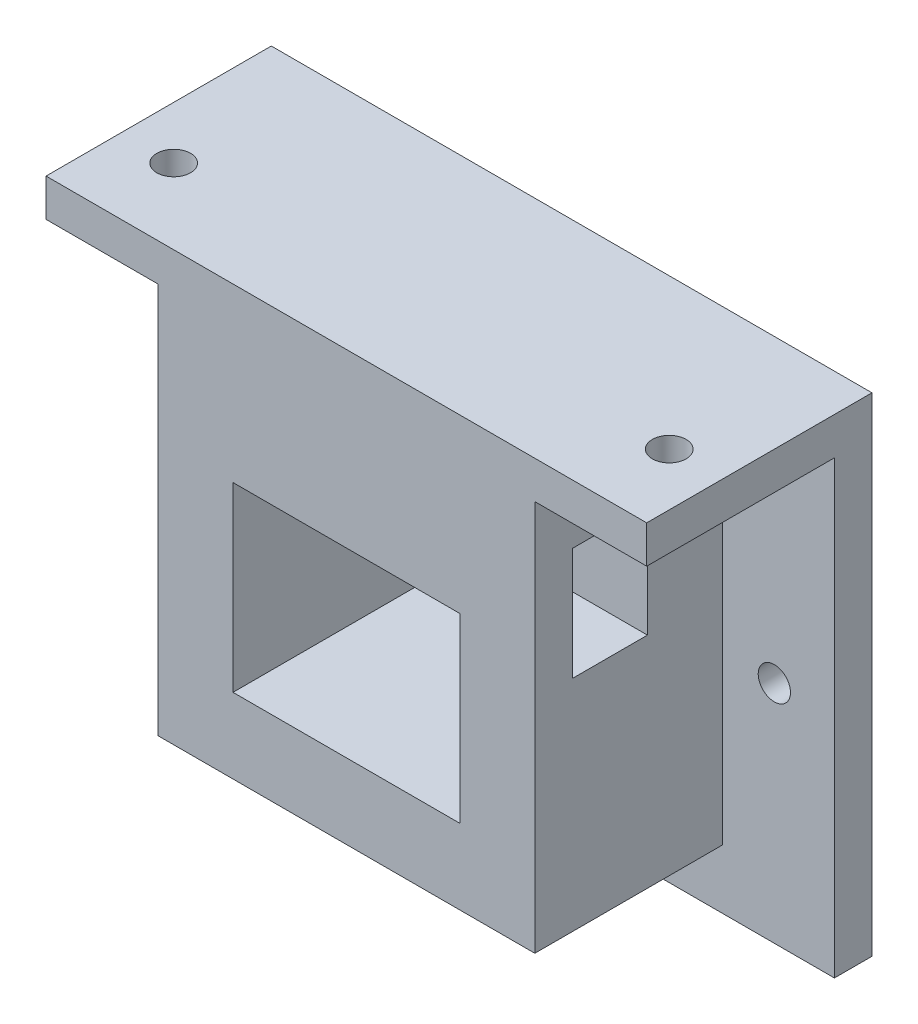
ISO-10303-21;
HEADER;
FILE_DESCRIPTION(('STEP AP214'),'2;1');
FILE_NAME('part.step','',(''),(''),'','','');
FILE_SCHEMA(('AUTOMOTIVE_DESIGN { 1 0 10303 214 1 1 1 1 }'));
ENDSEC;
DATA;
#1=APPLICATION_CONTEXT('core data for automotive mechanical design processes');
#2=APPLICATION_PROTOCOL_DEFINITION('international standard','automotive_design',2000,#1);
#3=PRODUCT_CONTEXT('',#1,'mechanical');
#4=PRODUCT('Part','Part','',(#3));
#5=PRODUCT_RELATED_PRODUCT_CATEGORY('part','',(#4));
#6=PRODUCT_DEFINITION_FORMATION('','',#4);
#7=PRODUCT_DEFINITION_CONTEXT('part definition',#1,'design');
#8=PRODUCT_DEFINITION('design','',#6,#7);
#9=PRODUCT_DEFINITION_SHAPE('','',#8);
#10=(LENGTH_UNIT() NAMED_UNIT(*) SI_UNIT(.MILLI.,.METRE.));
#11=(NAMED_UNIT(*) PLANE_ANGLE_UNIT() SI_UNIT($,.RADIAN.));
#12=(NAMED_UNIT(*) SI_UNIT($,.STERADIAN.) SOLID_ANGLE_UNIT());
#13=UNCERTAINTY_MEASURE_WITH_UNIT(LENGTH_MEASURE(1.E-05),#10,'distance_accuracy_value','');
#14=(GEOMETRIC_REPRESENTATION_CONTEXT(3) GLOBAL_UNCERTAINTY_ASSIGNED_CONTEXT((#13)) GLOBAL_UNIT_ASSIGNED_CONTEXT((#10,
#11,#12)) REPRESENTATION_CONTEXT('',''));
#15=CARTESIAN_POINT('',(0.,0.,0.));
#16=DIRECTION('',(0.,0.,1.));
#17=DIRECTION('',(1.,0.,0.));
#18=AXIS2_PLACEMENT_3D('',#15,#16,#17);
#19=CARTESIAN_POINT('',(0.,0.,5.));
#20=DIRECTION('',(0.,0.,-1.));
#21=DIRECTION('',(-1.,0.,0.));
#22=AXIS2_PLACEMENT_3D('',#19,#20,#21);
#23=PLANE('',#22);
#24=CARTESIAN_POINT('',(8.,30.,5.));
#25=DIRECTION('',(0.,0.,-1.));
#26=DIRECTION('',(-1.,0.,0.));
#27=AXIS2_PLACEMENT_3D('',#24,#25,#26);
#28=CIRCLE('',#27,2.15);
#29=CARTESIAN_POINT('',(5.85,30.,5.));
#30=VERTEX_POINT('',#29);
#31=EDGE_CURVE('E589',#30,#30,#28,.T.);
#32=ORIENTED_EDGE('',*,*,#31,.T.);
#33=EDGE_LOOP('',(#32));
#34=FACE_BOUND('',#33,.T.);
#35=CARTESIAN_POINT('',(72.,30.,5.));
#36=DIRECTION('',(0.,0.,-1.));
#37=DIRECTION('',(-1.,0.,0.));
#38=AXIS2_PLACEMENT_3D('',#35,#36,#37);
#39=CIRCLE('',#38,2.14999999999999);
#40=CARTESIAN_POINT('',(69.85,30.,5.));
#41=VERTEX_POINT('',#40);
#42=EDGE_CURVE('E593',#41,#41,#39,.T.);
#43=ORIENTED_EDGE('',*,*,#42,.T.);
#44=EDGE_LOOP('',(#43));
#45=FACE_BOUND('',#44,.T.);
#46=DIRECTION('',(-1.,0.,0.));
#47=VECTOR('',#46,1.);
#48=CARTESIAN_POINT('',(0.,60.,5.));
#49=LINE('',#48,#47);
#50=CARTESIAN_POINT('',(80.,60.,5.));
#51=VERTEX_POINT('',#50);
#52=CARTESIAN_POINT('',(65.1,60.,5.));
#53=VERTEX_POINT('',#52);
#54=EDGE_CURVE('E415',#51,#53,#49,.T.);
#55=ORIENTED_EDGE('',*,*,#54,.T.);
#56=DIRECTION('',(0.,1.,0.));
#57=VECTOR('',#56,1.);
#58=CARTESIAN_POINT('',(65.1,7.9,5.));
#59=LINE('',#58,#57);
#60=CARTESIAN_POINT('',(65.1,7.9,5.));
#61=VERTEX_POINT('',#60);
#62=EDGE_CURVE('E378',#61,#53,#59,.T.);
#63=ORIENTED_EDGE('',*,*,#62,.F.);
#64=DIRECTION('',(1.,0.,0.));
#65=VECTOR('',#64,1.);
#66=CARTESIAN_POINT('',(14.9,7.9,5.));
#67=LINE('',#66,#65);
#68=CARTESIAN_POINT('',(14.9,7.9,5.));
#69=VERTEX_POINT('',#68);
#70=EDGE_CURVE('E389',#69,#61,#67,.T.);
#71=ORIENTED_EDGE('',*,*,#70,.F.);
#72=DIRECTION('',(0.,-1.,0.));
#73=VECTOR('',#72,1.);
#74=CARTESIAN_POINT('',(14.9,7.9,5.));
#75=LINE('',#74,#73);
#76=CARTESIAN_POINT('',(14.9,60.,5.));
#77=VERTEX_POINT('',#76);
#78=EDGE_CURVE('E372',#77,#69,#75,.T.);
#79=ORIENTED_EDGE('',*,*,#78,.F.);
#80=CARTESIAN_POINT('',(0.,60.,5.));
#81=VERTEX_POINT('',#80);
#82=EDGE_CURVE('E414',#77,#81,#49,.T.);
#83=ORIENTED_EDGE('',*,*,#82,.T.);
#84=DIRECTION('',(0.,-1.,0.));
#85=VECTOR('',#84,1.);
#86=CARTESIAN_POINT('',(0.,0.,5.));
#87=LINE('',#86,#85);
#88=CARTESIAN_POINT('',(0.,0.,5.));
#89=VERTEX_POINT('',#88);
#90=EDGE_CURVE('E402',#81,#89,#87,.T.);
#91=ORIENTED_EDGE('',*,*,#90,.T.);
#92=DIRECTION('',(1.,0.,0.));
#93=VECTOR('',#92,1.);
#94=CARTESIAN_POINT('',(0.,0.,5.));
#95=LINE('',#94,#93);
#96=CARTESIAN_POINT('',(80.,0.,5.));
#97=VERTEX_POINT('',#96);
#98=EDGE_CURVE('E406',#89,#97,#95,.T.);
#99=ORIENTED_EDGE('',*,*,#98,.T.);
#100=DIRECTION('',(0.,1.,0.));
#101=VECTOR('',#100,1.);
#102=CARTESIAN_POINT('',(80.,0.,5.));
#103=LINE('',#102,#101);
#104=EDGE_CURVE('E410',#97,#51,#103,.T.);
#105=ORIENTED_EDGE('',*,*,#104,.T.);
#106=EDGE_LOOP('',(#55,#63,#71,#79,#83,#91,#99,#105));
#107=FACE_BOUND('',#106,.T.);
#108=ADVANCED_FACE('F48',(#34,#45,#107),#23,.F.);
#109=CARTESIAN_POINT('',(14.9,7.9,30.));
#110=DIRECTION('',(1.,0.,0.));
#111=DIRECTION('',(0.,0.,-1.));
#112=AXIS2_PLACEMENT_3D('',#109,#110,#111);
#113=PLANE('',#112);
#114=DIRECTION('',(0.,0.,-1.));
#115=VECTOR('',#114,1.);
#116=CARTESIAN_POINT('',(14.9,60.,80.8178118379766));
#117=LINE('',#116,#115);
#118=CARTESIAN_POINT('',(14.9,60.,30.));
#119=VERTEX_POINT('',#118);
#120=EDGE_CURVE('E259',#119,#77,#117,.T.);
#121=ORIENTED_EDGE('',*,*,#120,.T.);
#122=ORIENTED_EDGE('',*,*,#78,.T.);
#123=DIRECTION('',(0.,0.,-1.));
#124=VECTOR('',#123,1.);
#125=CARTESIAN_POINT('',(14.9,7.9,30.));
#126=LINE('',#125,#124);
#127=CARTESIAN_POINT('',(14.9,7.9,30.));
#128=VERTEX_POINT('',#127);
#129=EDGE_CURVE('E216',#128,#69,#126,.T.);
#130=ORIENTED_EDGE('',*,*,#129,.F.);
#131=DIRECTION('',(0.,-1.,0.));
#132=VECTOR('',#131,1.);
#133=CARTESIAN_POINT('',(14.9,7.9,30.));
#134=LINE('',#133,#132);
#135=EDGE_CURVE('E373',#119,#128,#134,.T.);
#136=ORIENTED_EDGE('',*,*,#135,.F.);
#137=EDGE_LOOP('',(#121,#122,#130,#136));
#138=FACE_BOUND('',#137,.T.);
#139=DIRECTION('',(0.,-1.,0.));
#140=VECTOR('',#139,1.);
#141=CARTESIAN_POINT('',(14.9,7.9,15.));
#142=LINE('',#141,#140);
#143=CARTESIAN_POINT('',(14.9,52.1,15.));
#144=VERTEX_POINT('',#143);
#145=CARTESIAN_POINT('',(14.9,37.1,15.));
#146=VERTEX_POINT('',#145);
#147=EDGE_CURVE('E318',#144,#146,#142,.T.);
#148=ORIENTED_EDGE('',*,*,#147,.F.);
#149=DIRECTION('',(0.,0.,-1.));
#150=VECTOR('',#149,1.);
#151=CARTESIAN_POINT('',(14.9,52.1,80.8178118379766));
#152=LINE('',#151,#150);
#153=CARTESIAN_POINT('',(14.9,52.1,25.));
#154=VERTEX_POINT('',#153);
#155=EDGE_CURVE('E270',#154,#144,#152,.T.);
#156=ORIENTED_EDGE('',*,*,#155,.F.);
#157=DIRECTION('',(0.,1.,0.));
#158=VECTOR('',#157,1.);
#159=CARTESIAN_POINT('',(14.9,7.9,25.));
#160=LINE('',#159,#158);
#161=CARTESIAN_POINT('',(14.9,37.1,25.));
#162=VERTEX_POINT('',#161);
#163=EDGE_CURVE('E303',#162,#154,#160,.T.);
#164=ORIENTED_EDGE('',*,*,#163,.F.);
#165=DIRECTION('',(0.,0.,1.));
#166=VECTOR('',#165,1.);
#167=CARTESIAN_POINT('',(14.9,37.1,30.));
#168=LINE('',#167,#166);
#169=EDGE_CURVE('E328',#146,#162,#168,.T.);
#170=ORIENTED_EDGE('',*,*,#169,.F.);
#171=EDGE_LOOP('',(#148,#156,#164,#170));
#172=FACE_BOUND('',#171,.T.);
#173=ADVANCED_FACE('F504',(#138,#172),#113,.F.);
#174=CARTESIAN_POINT('',(65.1,7.9,30.));
#175=DIRECTION('',(-1.,0.,0.));
#176=DIRECTION('',(0.,0.,1.));
#177=AXIS2_PLACEMENT_3D('',#174,#175,#176);
#178=PLANE('',#177);
#179=ORIENTED_EDGE('',*,*,#62,.T.);
#180=DIRECTION('',(0.,0.,-1.));
#181=VECTOR('',#180,1.);
#182=CARTESIAN_POINT('',(65.1,60.,80.8178118379766));
#183=LINE('',#182,#181);
#184=CARTESIAN_POINT('',(65.1,60.,30.));
#185=VERTEX_POINT('',#184);
#186=EDGE_CURVE('E263',#185,#53,#183,.T.);
#187=ORIENTED_EDGE('',*,*,#186,.F.);
#188=DIRECTION('',(0.,1.,0.));
#189=VECTOR('',#188,1.);
#190=CARTESIAN_POINT('',(65.1,7.9,30.));
#191=LINE('',#190,#189);
#192=CARTESIAN_POINT('',(65.1,7.9,30.));
#193=VERTEX_POINT('',#192);
#194=EDGE_CURVE('E381',#193,#185,#191,.T.);
#195=ORIENTED_EDGE('',*,*,#194,.F.);
#196=DIRECTION('',(0.,0.,-1.));
#197=VECTOR('',#196,1.);
#198=CARTESIAN_POINT('',(65.1,7.9,30.));
#199=LINE('',#198,#197);
#200=EDGE_CURVE('E385',#193,#61,#199,.T.);
#201=ORIENTED_EDGE('',*,*,#200,.T.);
#202=EDGE_LOOP('',(#179,#187,#195,#201));
#203=FACE_BOUND('',#202,.T.);
#204=DIRECTION('',(0.,1.,0.));
#205=VECTOR('',#204,1.);
#206=CARTESIAN_POINT('',(65.1,7.9,15.));
#207=LINE('',#206,#205);
#208=CARTESIAN_POINT('',(65.1,37.1,15.));
#209=VERTEX_POINT('',#208);
#210=CARTESIAN_POINT('',(65.1,52.1,15.));
#211=VERTEX_POINT('',#210);
#212=EDGE_CURVE('E315',#209,#211,#207,.T.);
#213=ORIENTED_EDGE('',*,*,#212,.F.);
#214=DIRECTION('',(0.,0.,-1.));
#215=VECTOR('',#214,1.);
#216=CARTESIAN_POINT('',(65.1,37.1,30.));
#217=LINE('',#216,#215);
#218=CARTESIAN_POINT('',(65.1,37.1,25.));
#219=VERTEX_POINT('',#218);
#220=EDGE_CURVE('E325',#219,#209,#217,.T.);
#221=ORIENTED_EDGE('',*,*,#220,.F.);
#222=DIRECTION('',(0.,-1.,0.));
#223=VECTOR('',#222,1.);
#224=CARTESIAN_POINT('',(65.1,7.9,25.));
#225=LINE('',#224,#223);
#226=CARTESIAN_POINT('',(65.1,52.1,25.));
#227=VERTEX_POINT('',#226);
#228=EDGE_CURVE('E300',#227,#219,#225,.T.);
#229=ORIENTED_EDGE('',*,*,#228,.F.);
#230=DIRECTION('',(0.,0.,-1.));
#231=VECTOR('',#230,1.);
#232=CARTESIAN_POINT('',(65.1,52.1,80.8178118379766));
#233=LINE('',#232,#231);
#234=EDGE_CURVE('E266',#227,#211,#233,.T.);
#235=ORIENTED_EDGE('',*,*,#234,.T.);
#236=EDGE_LOOP('',(#213,#221,#229,#235));
#237=FACE_BOUND('',#236,.T.);
#238=ADVANCED_FACE('F498',(#203,#237),#178,.F.);
#239=CARTESIAN_POINT('',(24.9,17.9,30.));
#240=DIRECTION('',(1.,0.,0.));
#241=DIRECTION('',(0.,0.,-1.));
#242=AXIS2_PLACEMENT_3D('',#239,#240,#241);
#243=PLANE('',#242);
#244=DIRECTION('',(0.,-1.,0.));
#245=VECTOR('',#244,1.);
#246=CARTESIAN_POINT('',(24.9,17.9,5.));
#247=LINE('',#246,#245);
#248=CARTESIAN_POINT('',(24.9,34.3999999999999,5.));
#249=VERTEX_POINT('',#248);
#250=CARTESIAN_POINT('',(24.9,17.9,5.));
#251=VERTEX_POINT('',#250);
#252=EDGE_CURVE('E331',#249,#251,#247,.T.);
#253=ORIENTED_EDGE('',*,*,#252,.F.);
#254=DIRECTION('',(0.,0.707106781186551,0.707106781186544));
#255=VECTOR('',#254,1.);
#256=CARTESIAN_POINT('',(24.9,38.6499999999999,9.24999999999989));
#257=LINE('',#256,#255);
#258=CARTESIAN_POINT('',(24.9,42.1,12.7));
#259=VERTEX_POINT('',#258);
#260=EDGE_CURVE('E72',#249,#259,#257,.T.);
#261=ORIENTED_EDGE('',*,*,#260,.T.);
#262=DIRECTION('',(0.,0.,-1.));
#263=VECTOR('',#262,1.);
#264=CARTESIAN_POINT('',(24.9,42.1,30.));
#265=LINE('',#264,#263);
#266=CARTESIAN_POINT('',(24.9,42.1,15.));
#267=VERTEX_POINT('',#266);
#268=EDGE_CURVE('E346',#267,#259,#265,.T.);
#269=ORIENTED_EDGE('',*,*,#268,.F.);
#270=DIRECTION('',(0.,-1.,0.));
#271=VECTOR('',#270,1.);
#272=CARTESIAN_POINT('',(24.9,17.9,15.));
#273=LINE('',#272,#271);
#274=CARTESIAN_POINT('',(24.9,37.1,15.));
#275=VERTEX_POINT('',#274);
#276=EDGE_CURVE('E311',#267,#275,#273,.T.);
#277=ORIENTED_EDGE('',*,*,#276,.T.);
#278=DIRECTION('',(0.,0.,1.));
#279=VECTOR('',#278,1.);
#280=CARTESIAN_POINT('',(24.9,37.1,30.));
#281=LINE('',#280,#279);
#282=CARTESIAN_POINT('',(24.9,37.1,25.));
#283=VERTEX_POINT('',#282);
#284=EDGE_CURVE('E321',#275,#283,#281,.T.);
#285=ORIENTED_EDGE('',*,*,#284,.T.);
#286=DIRECTION('',(0.,1.,0.));
#287=VECTOR('',#286,1.);
#288=CARTESIAN_POINT('',(24.9,17.9,25.));
#289=LINE('',#288,#287);
#290=CARTESIAN_POINT('',(24.9,42.1,25.));
#291=VERTEX_POINT('',#290);
#292=EDGE_CURVE('E296',#283,#291,#289,.T.);
#293=ORIENTED_EDGE('',*,*,#292,.T.);
#294=CARTESIAN_POINT('',(24.9,42.1,30.));
#295=VERTEX_POINT('',#294);
#296=EDGE_CURVE('E356',#295,#291,#265,.T.);
#297=ORIENTED_EDGE('',*,*,#296,.F.);
#298=DIRECTION('',(0.,-1.,0.));
#299=VECTOR('',#298,1.);
#300=CARTESIAN_POINT('',(24.9,17.9,30.));
#301=LINE('',#300,#299);
#302=CARTESIAN_POINT('',(24.9,17.9,30.));
#303=VERTEX_POINT('',#302);
#304=EDGE_CURVE('E332',#295,#303,#301,.T.);
#305=ORIENTED_EDGE('',*,*,#304,.T.);
#306=DIRECTION('',(0.,0.,-1.));
#307=VECTOR('',#306,1.);
#308=CARTESIAN_POINT('',(24.9,17.9,30.));
#309=LINE('',#308,#307);
#310=EDGE_CURVE('E368',#303,#251,#309,.T.);
#311=ORIENTED_EDGE('',*,*,#310,.T.);
#312=EDGE_LOOP('',(#253,#261,#269,#277,#285,#293,#297,#305,#311));
#313=FACE_BOUND('',#312,.T.);
#314=ADVANCED_FACE('F463',(#313),#243,.T.);
#315=CARTESIAN_POINT('',(55.1,17.9,30.));
#316=DIRECTION('',(-1.,0.,0.));
#317=DIRECTION('',(0.,0.,1.));
#318=AXIS2_PLACEMENT_3D('',#315,#316,#317);
#319=PLANE('',#318);
#320=DIRECTION('',(0.,0.,-1.));
#321=VECTOR('',#320,1.);
#322=CARTESIAN_POINT('',(55.1,42.1,30.));
#323=LINE('',#322,#321);
#324=CARTESIAN_POINT('',(55.1,42.1,15.));
#325=VERTEX_POINT('',#324);
#326=CARTESIAN_POINT('',(55.1,42.1,12.7));
#327=VERTEX_POINT('',#326);
#328=EDGE_CURVE('E360',#325,#327,#323,.T.);
#329=ORIENTED_EDGE('',*,*,#328,.T.);
#330=DIRECTION('',(0.,-0.707106781186551,-0.707106781186544));
#331=VECTOR('',#330,1.);
#332=CARTESIAN_POINT('',(55.1,38.6499999999999,9.24999999999989));
#333=LINE('',#332,#331);
#334=CARTESIAN_POINT('',(55.1,34.3999999999999,5.));
#335=VERTEX_POINT('',#334);
#336=EDGE_CURVE('E11',#327,#335,#333,.T.);
#337=ORIENTED_EDGE('',*,*,#336,.T.);
#338=DIRECTION('',(0.,1.,0.));
#339=VECTOR('',#338,1.);
#340=CARTESIAN_POINT('',(55.1,17.9,5.));
#341=LINE('',#340,#339);
#342=CARTESIAN_POINT('',(55.1,17.9,5.));
#343=VERTEX_POINT('',#342);
#344=EDGE_CURVE('E336',#343,#335,#341,.T.);
#345=ORIENTED_EDGE('',*,*,#344,.F.);
#346=DIRECTION('',(0.,0.,-1.));
#347=VECTOR('',#346,1.);
#348=CARTESIAN_POINT('',(55.1,17.9,30.));
#349=LINE('',#348,#347);
#350=CARTESIAN_POINT('',(55.1,17.9,30.));
#351=VERTEX_POINT('',#350);
#352=EDGE_CURVE('E365',#351,#343,#349,.T.);
#353=ORIENTED_EDGE('',*,*,#352,.F.);
#354=DIRECTION('',(0.,1.,0.));
#355=VECTOR('',#354,1.);
#356=CARTESIAN_POINT('',(55.1,17.9,30.));
#357=LINE('',#356,#355);
#358=CARTESIAN_POINT('',(55.1,42.1,30.));
#359=VERTEX_POINT('',#358);
#360=EDGE_CURVE('E339',#351,#359,#357,.T.);
#361=ORIENTED_EDGE('',*,*,#360,.T.);
#362=CARTESIAN_POINT('',(55.1,42.1,25.));
#363=VERTEX_POINT('',#362);
#364=EDGE_CURVE('E361',#359,#363,#323,.T.);
#365=ORIENTED_EDGE('',*,*,#364,.T.);
#366=DIRECTION('',(0.,-1.,0.));
#367=VECTOR('',#366,1.);
#368=CARTESIAN_POINT('',(55.1,17.9,25.));
#369=LINE('',#368,#367);
#370=CARTESIAN_POINT('',(55.1,37.1,25.));
#371=VERTEX_POINT('',#370);
#372=EDGE_CURVE('E292',#363,#371,#369,.T.);
#373=ORIENTED_EDGE('',*,*,#372,.T.);
#374=DIRECTION('',(0.,0.,-1.));
#375=VECTOR('',#374,1.);
#376=CARTESIAN_POINT('',(55.1,37.1,30.));
#377=LINE('',#376,#375);
#378=CARTESIAN_POINT('',(55.1,37.1,15.));
#379=VERTEX_POINT('',#378);
#380=EDGE_CURVE('E438',#371,#379,#377,.T.);
#381=ORIENTED_EDGE('',*,*,#380,.T.);
#382=DIRECTION('',(0.,1.,0.));
#383=VECTOR('',#382,1.);
#384=CARTESIAN_POINT('',(55.1,17.9,15.));
#385=LINE('',#384,#383);
#386=EDGE_CURVE('E307',#379,#325,#385,.T.);
#387=ORIENTED_EDGE('',*,*,#386,.T.);
#388=EDGE_LOOP('',(#329,#337,#345,#353,#361,#365,#373,#381,#387));
#389=FACE_BOUND('',#388,.T.);
#390=ADVANCED_FACE('F470',(#389),#319,.T.);
#391=CARTESIAN_POINT('',(24.9,42.1,30.));
#392=DIRECTION('',(0.,-1.,0.));
#393=DIRECTION('',(0.,0.,-1.));
#394=AXIS2_PLACEMENT_3D('',#391,#392,#393);
#395=PLANE('',#394);
#396=ORIENTED_EDGE('',*,*,#268,.T.);
#397=DIRECTION('',(1.,0.,0.));
#398=VECTOR('',#397,1.);
#399=CARTESIAN_POINT('',(24.9,42.1,12.7));
#400=LINE('',#399,#398);
#401=EDGE_CURVE('E58',#259,#327,#400,.T.);
#402=ORIENTED_EDGE('',*,*,#401,.T.);
#403=ORIENTED_EDGE('',*,*,#328,.F.);
#404=DIRECTION('',(-1.,0.,0.));
#405=VECTOR('',#404,1.);
#406=CARTESIAN_POINT('',(24.9,42.1,15.));
#407=LINE('',#406,#405);
#408=EDGE_CURVE('E434',#325,#267,#407,.T.);
#409=ORIENTED_EDGE('',*,*,#408,.T.);
#410=EDGE_LOOP('',(#396,#402,#403,#409));
#411=FACE_BOUND('',#410,.T.);
#412=ADVANCED_FACE('F467',(#411),#395,.T.);
#413=ORIENTED_EDGE('',*,*,#296,.T.);
#414=DIRECTION('',(1.,0.,0.));
#415=VECTOR('',#414,1.);
#416=CARTESIAN_POINT('',(24.9,42.1,25.));
#417=LINE('',#416,#415);
#418=EDGE_CURVE('E430',#291,#363,#417,.T.);
#419=ORIENTED_EDGE('',*,*,#418,.T.);
#420=ORIENTED_EDGE('',*,*,#364,.F.);
#421=DIRECTION('',(-1.,0.,0.));
#422=VECTOR('',#421,1.);
#423=CARTESIAN_POINT('',(24.9,42.1,30.));
#424=LINE('',#423,#422);
#425=EDGE_CURVE('E343',#359,#295,#424,.T.);
#426=ORIENTED_EDGE('',*,*,#425,.T.);
#427=EDGE_LOOP('',(#413,#419,#420,#426));
#428=FACE_BOUND('',#427,.T.);
#429=ADVANCED_FACE('F488',(#428),#395,.T.);
#430=CARTESIAN_POINT('',(0.,0.,5.));
#431=DIRECTION('',(1.,0.,0.));
#432=DIRECTION('',(0.,0.,-1.));
#433=AXIS2_PLACEMENT_3D('',#430,#431,#432);
#434=PLANE('',#433);
#435=DIRECTION('',(0.,-1.,0.));
#436=VECTOR('',#435,1.);
#437=CARTESIAN_POINT('',(0.,0.,0.));
#438=LINE('',#437,#436);
#439=CARTESIAN_POINT('',(0.,65.,0.));
#440=VERTEX_POINT('',#439);
#441=CARTESIAN_POINT('',(0.,0.,0.));
#442=VERTEX_POINT('',#441);
#443=EDGE_CURVE('E205',#440,#442,#438,.T.);
#444=ORIENTED_EDGE('',*,*,#443,.T.);
#445=DIRECTION('',(0.,0.,-1.));
#446=VECTOR('',#445,1.);
#447=CARTESIAN_POINT('',(0.,0.,5.));
#448=LINE('',#447,#446);
#449=EDGE_CURVE('E427',#89,#442,#448,.T.);
#450=ORIENTED_EDGE('',*,*,#449,.F.);
#451=ORIENTED_EDGE('',*,*,#90,.F.);
#452=DIRECTION('',(0.,0.,1.));
#453=VECTOR('',#452,1.);
#454=CARTESIAN_POINT('',(0.,60.,0.));
#455=LINE('',#454,#453);
#456=CARTESIAN_POINT('',(0.,60.,30.));
#457=VERTEX_POINT('',#456);
#458=EDGE_CURVE('E249',#81,#457,#455,.T.);
#459=ORIENTED_EDGE('',*,*,#458,.T.);
#460=DIRECTION('',(0.,-1.,0.));
#461=VECTOR('',#460,1.);
#462=CARTESIAN_POINT('',(0.,65.,30.));
#463=LINE('',#462,#461);
#464=CARTESIAN_POINT('',(0.,65.,30.));
#465=VERTEX_POINT('',#464);
#466=EDGE_CURVE('E222',#465,#457,#463,.T.);
#467=ORIENTED_EDGE('',*,*,#466,.F.);
#468=DIRECTION('',(0.,0.,1.));
#469=VECTOR('',#468,1.);
#470=CARTESIAN_POINT('',(0.,65.,0.));
#471=LINE('',#470,#469);
#472=EDGE_CURVE('E219',#440,#465,#471,.T.);
#473=ORIENTED_EDGE('',*,*,#472,.F.);
#474=EDGE_LOOP('',(#444,#450,#451,#459,#467,#473));
#475=FACE_BOUND('',#474,.T.);
#476=ADVANCED_FACE('F220',(#475),#434,.F.);
#477=CARTESIAN_POINT('',(0.,0.,5.));
#478=DIRECTION('',(0.,1.,0.));
#479=DIRECTION('',(0.,0.,1.));
#480=AXIS2_PLACEMENT_3D('',#477,#478,#479);
#481=PLANE('',#480);
#482=DIRECTION('',(1.,0.,0.));
#483=VECTOR('',#482,1.);
#484=CARTESIAN_POINT('',(0.,0.,0.));
#485=LINE('',#484,#483);
#486=CARTESIAN_POINT('',(80.,0.,0.));
#487=VERTEX_POINT('',#486);
#488=EDGE_CURVE('E211',#442,#487,#485,.T.);
#489=ORIENTED_EDGE('',*,*,#488,.T.);
#490=DIRECTION('',(0.,0.,-1.));
#491=VECTOR('',#490,1.);
#492=CARTESIAN_POINT('',(80.,0.,5.));
#493=LINE('',#492,#491);
#494=EDGE_CURVE('E418',#97,#487,#493,.T.);
#495=ORIENTED_EDGE('',*,*,#494,.F.);
#496=ORIENTED_EDGE('',*,*,#98,.F.);
#497=ORIENTED_EDGE('',*,*,#449,.T.);
#498=EDGE_LOOP('',(#489,#495,#496,#497));
#499=FACE_BOUND('',#498,.T.);
#500=ADVANCED_FACE('F527',(#499),#481,.F.);
#501=CARTESIAN_POINT('',(80.,0.,5.));
#502=DIRECTION('',(-1.,0.,0.));
#503=DIRECTION('',(0.,0.,1.));
#504=AXIS2_PLACEMENT_3D('',#501,#502,#503);
#505=PLANE('',#504);
#506=DIRECTION('',(0.,1.,0.));
#507=VECTOR('',#506,1.);
#508=CARTESIAN_POINT('',(80.,0.,0.));
#509=LINE('',#508,#507);
#510=CARTESIAN_POINT('',(80.,65.,0.));
#511=VERTEX_POINT('',#510);
#512=EDGE_CURVE('E407',#487,#511,#509,.T.);
#513=ORIENTED_EDGE('',*,*,#512,.T.);
#514=DIRECTION('',(0.,0.,-1.));
#515=VECTOR('',#514,1.);
#516=CARTESIAN_POINT('',(80.,65.,0.));
#517=LINE('',#516,#515);
#518=CARTESIAN_POINT('',(80.,65.,30.));
#519=VERTEX_POINT('',#518);
#520=EDGE_CURVE('E232',#519,#511,#517,.T.);
#521=ORIENTED_EDGE('',*,*,#520,.F.);
#522=DIRECTION('',(0.,-1.,0.));
#523=VECTOR('',#522,1.);
#524=CARTESIAN_POINT('',(80.,65.,30.));
#525=LINE('',#524,#523);
#526=CARTESIAN_POINT('',(80.,60.,30.));
#527=VERTEX_POINT('',#526);
#528=EDGE_CURVE('E248',#519,#527,#525,.T.);
#529=ORIENTED_EDGE('',*,*,#528,.T.);
#530=DIRECTION('',(0.,0.,-1.));
#531=VECTOR('',#530,1.);
#532=CARTESIAN_POINT('',(80.,60.,0.));
#533=LINE('',#532,#531);
#534=EDGE_CURVE('E234',#527,#51,#533,.T.);
#535=ORIENTED_EDGE('',*,*,#534,.T.);
#536=ORIENTED_EDGE('',*,*,#104,.F.);
#537=ORIENTED_EDGE('',*,*,#494,.T.);
#538=EDGE_LOOP('',(#513,#521,#529,#535,#536,#537));
#539=FACE_BOUND('',#538,.T.);
#540=ADVANCED_FACE('F523',(#539),#505,.F.);
#541=CARTESIAN_POINT('',(0.,0.,0.));
#542=DIRECTION('',(0.,0.,-1.));
#543=DIRECTION('',(-1.,0.,0.));
#544=AXIS2_PLACEMENT_3D('',#541,#542,#543);
#545=PLANE('',#544);
#546=CARTESIAN_POINT('',(8.,30.,0.));
#547=DIRECTION('',(0.,0.,1.));
#548=DIRECTION('',(1.,0.,0.));
#549=AXIS2_PLACEMENT_3D('',#546,#547,#548);
#550=CIRCLE('',#549,2.15);
#551=CARTESIAN_POINT('',(10.15,30.,0.));
#552=VERTEX_POINT('',#551);
#553=EDGE_CURVE('E597',#552,#552,#550,.T.);
#554=ORIENTED_EDGE('',*,*,#553,.T.);
#555=EDGE_LOOP('',(#554));
#556=FACE_BOUND('',#555,.T.);
#557=CARTESIAN_POINT('',(72.,30.,0.));
#558=DIRECTION('',(0.,0.,1.));
#559=DIRECTION('',(-1.,0.,0.));
#560=AXIS2_PLACEMENT_3D('',#557,#558,#559);
#561=CIRCLE('',#560,2.14999999999999);
#562=CARTESIAN_POINT('',(69.85,30.,0.));
#563=VERTEX_POINT('',#562);
#564=EDGE_CURVE('E601',#563,#563,#561,.T.);
#565=ORIENTED_EDGE('',*,*,#564,.T.);
#566=EDGE_LOOP('',(#565));
#567=FACE_BOUND('',#566,.T.);
#568=ORIENTED_EDGE('',*,*,#443,.F.);
#569=DIRECTION('',(-1.,0.,0.));
#570=VECTOR('',#569,1.);
#571=CARTESIAN_POINT('',(0.,65.,0.));
#572=LINE('',#571,#570);
#573=EDGE_CURVE('E210',#511,#440,#572,.T.);
#574=ORIENTED_EDGE('',*,*,#573,.F.);
#575=ORIENTED_EDGE('',*,*,#512,.F.);
#576=ORIENTED_EDGE('',*,*,#488,.F.);
#577=EDGE_LOOP('',(#568,#574,#575,#576));
#578=FACE_BOUND('',#577,.T.);
#579=ADVANCED_FACE('F207',(#556,#567,#578),#545,.T.);
#580=CARTESIAN_POINT('',(0.,0.,30.));
#581=DIRECTION('',(0.,0.,-1.));
#582=DIRECTION('',(-1.,0.,0.));
#583=AXIS2_PLACEMENT_3D('',#580,#581,#582);
#584=PLANE('',#583);
#585=ORIENTED_EDGE('',*,*,#135,.T.);
#586=DIRECTION('',(1.,0.,0.));
#587=VECTOR('',#586,1.);
#588=CARTESIAN_POINT('',(14.9,7.9,30.));
#589=LINE('',#588,#587);
#590=EDGE_CURVE('E377',#128,#193,#589,.T.);
#591=ORIENTED_EDGE('',*,*,#590,.T.);
#592=ORIENTED_EDGE('',*,*,#194,.T.);
#593=DIRECTION('',(-1.,0.,0.));
#594=VECTOR('',#593,1.);
#595=CARTESIAN_POINT('',(0.,60.,30.));
#596=LINE('',#595,#594);
#597=EDGE_CURVE('E238',#527,#185,#596,.T.);
#598=ORIENTED_EDGE('',*,*,#597,.F.);
#599=ORIENTED_EDGE('',*,*,#528,.F.);
#600=DIRECTION('',(-1.,0.,0.));
#601=VECTOR('',#600,1.);
#602=CARTESIAN_POINT('',(0.,65.,30.));
#603=LINE('',#602,#601);
#604=EDGE_CURVE('E227',#519,#465,#603,.T.);
#605=ORIENTED_EDGE('',*,*,#604,.T.);
#606=ORIENTED_EDGE('',*,*,#466,.T.);
#607=EDGE_CURVE('E252',#119,#457,#596,.T.);
#608=ORIENTED_EDGE('',*,*,#607,.F.);
#609=EDGE_LOOP('',(#585,#591,#592,#598,#599,#605,#606,#608));
#610=FACE_BOUND('',#609,.T.);
#611=ORIENTED_EDGE('',*,*,#304,.F.);
#612=ORIENTED_EDGE('',*,*,#425,.F.);
#613=ORIENTED_EDGE('',*,*,#360,.F.);
#614=DIRECTION('',(1.,0.,0.));
#615=VECTOR('',#614,1.);
#616=CARTESIAN_POINT('',(24.9,17.9,30.));
#617=LINE('',#616,#615);
#618=EDGE_CURVE('E335',#303,#351,#617,.T.);
#619=ORIENTED_EDGE('',*,*,#618,.F.);
#620=EDGE_LOOP('',(#611,#612,#613,#619));
#621=FACE_BOUND('',#620,.T.);
#622=ADVANCED_FACE('F485',(#610,#621),#584,.F.);
#623=CARTESIAN_POINT('',(14.9,7.9,30.));
#624=DIRECTION('',(0.,1.,0.));
#625=DIRECTION('',(0.,0.,1.));
#626=AXIS2_PLACEMENT_3D('',#623,#624,#625);
#627=PLANE('',#626);
#628=ORIENTED_EDGE('',*,*,#70,.T.);
#629=ORIENTED_EDGE('',*,*,#200,.F.);
#630=ORIENTED_EDGE('',*,*,#590,.F.);
#631=ORIENTED_EDGE('',*,*,#129,.T.);
#632=EDGE_LOOP('',(#628,#629,#630,#631));
#633=FACE_BOUND('',#632,.T.);
#634=ADVANCED_FACE('F518',(#633),#627,.F.);
#635=CARTESIAN_POINT('',(24.9,17.9,30.));
#636=DIRECTION('',(0.,1.,0.));
#637=DIRECTION('',(0.,0.,1.));
#638=AXIS2_PLACEMENT_3D('',#635,#636,#637);
#639=PLANE('',#638);
#640=DIRECTION('',(1.,0.,0.));
#641=VECTOR('',#640,1.);
#642=CARTESIAN_POINT('',(24.9,17.9,5.));
#643=LINE('',#642,#641);
#644=EDGE_CURVE('E349',#251,#343,#643,.T.);
#645=ORIENTED_EDGE('',*,*,#644,.F.);
#646=ORIENTED_EDGE('',*,*,#310,.F.);
#647=ORIENTED_EDGE('',*,*,#618,.T.);
#648=ORIENTED_EDGE('',*,*,#352,.T.);
#649=EDGE_LOOP('',(#645,#646,#647,#648));
#650=FACE_BOUND('',#649,.T.);
#651=ADVANCED_FACE('F481',(#650),#639,.T.);
#652=ORIENTED_EDGE('',*,*,#344,.T.);
#653=DIRECTION('',(-1.,0.,0.));
#654=VECTOR('',#653,1.);
#655=CARTESIAN_POINT('',(0.,34.3999999999999,5.));
#656=LINE('',#655,#654);
#657=EDGE_CURVE('E442',#335,#249,#656,.T.);
#658=ORIENTED_EDGE('',*,*,#657,.T.);
#659=ORIENTED_EDGE('',*,*,#252,.T.);
#660=ORIENTED_EDGE('',*,*,#644,.T.);
#661=EDGE_LOOP('',(#652,#658,#659,#660));
#662=FACE_BOUND('',#661,.T.);
#663=ADVANCED_FACE('F475',(#662),#23,.F.);
#664=CARTESIAN_POINT('',(0.,37.1,15.));
#665=DIRECTION('',(0.,1.,0.));
#666=DIRECTION('',(0.,0.,1.));
#667=AXIS2_PLACEMENT_3D('',#664,#665,#666);
#668=PLANE('',#667);
#669=ORIENTED_EDGE('',*,*,#169,.T.);
#670=DIRECTION('',(1.,0.,0.));
#671=VECTOR('',#670,1.);
#672=CARTESIAN_POINT('',(0.,37.1,25.));
#673=LINE('',#672,#671);
#674=EDGE_CURVE('E286',#162,#283,#673,.T.);
#675=ORIENTED_EDGE('',*,*,#674,.T.);
#676=ORIENTED_EDGE('',*,*,#284,.F.);
#677=DIRECTION('',(1.,0.,0.));
#678=VECTOR('',#677,1.);
#679=CARTESIAN_POINT('',(0.,37.1,15.));
#680=LINE('',#679,#678);
#681=EDGE_CURVE('E291',#146,#275,#680,.T.);
#682=ORIENTED_EDGE('',*,*,#681,.F.);
#683=EDGE_LOOP('',(#669,#675,#676,#682));
#684=FACE_BOUND('',#683,.T.);
#685=ADVANCED_FACE('F458',(#684),#668,.T.);
#686=ORIENTED_EDGE('',*,*,#220,.T.);
#687=EDGE_CURVE('E287',#379,#209,#680,.T.);
#688=ORIENTED_EDGE('',*,*,#687,.F.);
#689=ORIENTED_EDGE('',*,*,#380,.F.);
#690=EDGE_CURVE('E282',#371,#219,#673,.T.);
#691=ORIENTED_EDGE('',*,*,#690,.T.);
#692=EDGE_LOOP('',(#686,#688,#689,#691));
#693=FACE_BOUND('',#692,.T.);
#694=ADVANCED_FACE('F494',(#693),#668,.T.);
#695=CARTESIAN_POINT('',(0.,37.1,15.));
#696=DIRECTION('',(0.,0.,1.));
#697=DIRECTION('',(1.,0.,0.));
#698=AXIS2_PLACEMENT_3D('',#695,#696,#697);
#699=PLANE('',#698);
#700=ORIENTED_EDGE('',*,*,#147,.T.);
#701=ORIENTED_EDGE('',*,*,#681,.T.);
#702=ORIENTED_EDGE('',*,*,#276,.F.);
#703=ORIENTED_EDGE('',*,*,#408,.F.);
#704=ORIENTED_EDGE('',*,*,#386,.F.);
#705=ORIENTED_EDGE('',*,*,#687,.T.);
#706=ORIENTED_EDGE('',*,*,#212,.T.);
#707=DIRECTION('',(1.,0.,0.));
#708=VECTOR('',#707,1.);
#709=CARTESIAN_POINT('',(0.,52.1,15.));
#710=LINE('',#709,#708);
#711=EDGE_CURVE('E274',#144,#211,#710,.T.);
#712=ORIENTED_EDGE('',*,*,#711,.F.);
#713=EDGE_LOOP('',(#700,#701,#702,#703,#704,#705,#706,#712));
#714=FACE_BOUND('',#713,.T.);
#715=ADVANCED_FACE('F466',(#714),#699,.T.);
#716=CARTESIAN_POINT('',(0.,37.1,25.));
#717=DIRECTION('',(0.,0.,-1.));
#718=DIRECTION('',(-1.,0.,0.));
#719=AXIS2_PLACEMENT_3D('',#716,#717,#718);
#720=PLANE('',#719);
#721=ORIENTED_EDGE('',*,*,#163,.T.);
#722=DIRECTION('',(1.,0.,0.));
#723=VECTOR('',#722,1.);
#724=CARTESIAN_POINT('',(0.,52.1,25.));
#725=LINE('',#724,#723);
#726=EDGE_CURVE('E278',#154,#227,#725,.T.);
#727=ORIENTED_EDGE('',*,*,#726,.T.);
#728=ORIENTED_EDGE('',*,*,#228,.T.);
#729=ORIENTED_EDGE('',*,*,#690,.F.);
#730=ORIENTED_EDGE('',*,*,#372,.F.);
#731=ORIENTED_EDGE('',*,*,#418,.F.);
#732=ORIENTED_EDGE('',*,*,#292,.F.);
#733=ORIENTED_EDGE('',*,*,#674,.F.);
#734=EDGE_LOOP('',(#721,#727,#728,#729,#730,#731,#732,#733));
#735=FACE_BOUND('',#734,.T.);
#736=ADVANCED_FACE('F489',(#735),#720,.T.);
#737=CARTESIAN_POINT('',(14.9,52.1,80.8178118379766));
#738=DIRECTION('',(0.,1.,0.));
#739=DIRECTION('',(0.,0.,1.));
#740=AXIS2_PLACEMENT_3D('',#737,#738,#739);
#741=PLANE('',#740);
#742=ORIENTED_EDGE('',*,*,#711,.T.);
#743=ORIENTED_EDGE('',*,*,#234,.F.);
#744=ORIENTED_EDGE('',*,*,#726,.F.);
#745=ORIENTED_EDGE('',*,*,#155,.T.);
#746=EDGE_LOOP('',(#742,#743,#744,#745));
#747=FACE_BOUND('',#746,.T.);
#748=ADVANCED_FACE('F501',(#747),#741,.F.);
#749=CARTESIAN_POINT('',(0.,34.3999999999999,5.));
#750=DIRECTION('',(0.,0.707106781186544,-0.707106781186551));
#751=DIRECTION('',(-1.,0.,0.));
#752=AXIS2_PLACEMENT_3D('',#749,#750,#751);
#753=PLANE('',#752);
#754=ORIENTED_EDGE('',*,*,#336,.F.);
#755=ORIENTED_EDGE('',*,*,#401,.F.);
#756=ORIENTED_EDGE('',*,*,#260,.F.);
#757=ORIENTED_EDGE('',*,*,#657,.F.);
#758=EDGE_LOOP('',(#754,#755,#756,#757));
#759=FACE_BOUND('',#758,.T.);
#760=ADVANCED_FACE('F51',(#759),#753,.F.);
#761=CARTESIAN_POINT('',(0.,60.,0.));
#762=DIRECTION('',(0.,1.,0.));
#763=DIRECTION('',(0.,0.,1.));
#764=AXIS2_PLACEMENT_3D('',#761,#762,#763);
#765=PLANE('',#764);
#766=CARTESIAN_POINT('',(73.,60.,20.));
#767=DIRECTION('',(0.,1.,0.));
#768=DIRECTION('',(0.,0.,-1.));
#769=AXIS2_PLACEMENT_3D('',#766,#767,#768);
#770=CIRCLE('',#769,2.25);
#771=CARTESIAN_POINT('',(73.,60.,17.75));
#772=VERTEX_POINT('',#771);
#773=EDGE_CURVE('E585',#772,#772,#770,.T.);
#774=ORIENTED_EDGE('',*,*,#773,.T.);
#775=EDGE_LOOP('',(#774));
#776=FACE_BOUND('',#775,.T.);
#777=ORIENTED_EDGE('',*,*,#597,.T.);
#778=ORIENTED_EDGE('',*,*,#186,.T.);
#779=ORIENTED_EDGE('',*,*,#54,.F.);
#780=ORIENTED_EDGE('',*,*,#534,.F.);
#781=EDGE_LOOP('',(#777,#778,#779,#780));
#782=FACE_BOUND('',#781,.T.);
#783=ADVANCED_FACE('F568',(#776,#782),#765,.F.);
#784=CARTESIAN_POINT('',(0.,65.,0.));
#785=DIRECTION('',(0.,1.,0.));
#786=DIRECTION('',(0.,0.,1.));
#787=AXIS2_PLACEMENT_3D('',#784,#785,#786);
#788=PLANE('',#787);
#789=CARTESIAN_POINT('',(73.,65.,20.));
#790=DIRECTION('',(0.,1.,0.));
#791=DIRECTION('',(0.,0.,1.));
#792=AXIS2_PLACEMENT_3D('',#789,#790,#791);
#793=CIRCLE('',#792,2.25);
#794=CARTESIAN_POINT('',(73.,65.,22.25));
#795=VERTEX_POINT('',#794);
#796=EDGE_CURVE('E582',#795,#795,#793,.T.);
#797=ORIENTED_EDGE('',*,*,#796,.F.);
#798=EDGE_LOOP('',(#797));
#799=FACE_BOUND('',#798,.T.);
#800=CARTESIAN_POINT('',(6.99999999999999,65.,20.));
#801=DIRECTION('',(0.,1.,0.));
#802=DIRECTION('',(0.,0.,1.));
#803=AXIS2_PLACEMENT_3D('',#800,#801,#802);
#804=CIRCLE('',#803,2.25);
#805=CARTESIAN_POINT('',(6.99999999999999,65.,22.25));
#806=VERTEX_POINT('',#805);
#807=EDGE_CURVE('E241',#806,#806,#804,.F.);
#808=ORIENTED_EDGE('',*,*,#807,.T.);
#809=EDGE_LOOP('',(#808));
#810=FACE_BOUND('',#809,.T.);
#811=ORIENTED_EDGE('',*,*,#573,.T.);
#812=ORIENTED_EDGE('',*,*,#472,.T.);
#813=ORIENTED_EDGE('',*,*,#604,.F.);
#814=ORIENTED_EDGE('',*,*,#520,.T.);
#815=EDGE_LOOP('',(#811,#812,#813,#814));
#816=FACE_BOUND('',#815,.T.);
#817=ADVANCED_FACE('F230',(#799,#810,#816),#788,.T.);
#818=CARTESIAN_POINT('',(6.99999999999999,60.,20.));
#819=DIRECTION('',(0.,-1.,0.));
#820=DIRECTION('',(0.,0.,-1.));
#821=AXIS2_PLACEMENT_3D('',#818,#819,#820);
#822=CIRCLE('',#821,2.25);
#823=CARTESIAN_POINT('',(6.99999999999999,60.,17.75));
#824=VERTEX_POINT('',#823);
#825=EDGE_CURVE('E579',#824,#824,#822,.T.);
#826=ORIENTED_EDGE('',*,*,#825,.F.);
#827=EDGE_LOOP('',(#826));
#828=FACE_BOUND('',#827,.T.);
#829=ORIENTED_EDGE('',*,*,#82,.F.);
#830=ORIENTED_EDGE('',*,*,#120,.F.);
#831=ORIENTED_EDGE('',*,*,#607,.T.);
#832=ORIENTED_EDGE('',*,*,#458,.F.);
#833=EDGE_LOOP('',(#829,#830,#831,#832));
#834=FACE_BOUND('',#833,.T.);
#835=ADVANCED_FACE('F574',(#828,#834),#765,.F.);
#836=CARTESIAN_POINT('',(6.99999999999999,71.3639610306789,20.));
#837=DIRECTION('',(0.,-1.,0.));
#838=DIRECTION('',(0.,0.,-1.));
#839=AXIS2_PLACEMENT_3D('',#836,#837,#838);
#840=CYLINDRICAL_SURFACE('',#839,2.25);
#841=ORIENTED_EDGE('',*,*,#825,.T.);
#842=EDGE_LOOP('',(#841));
#843=FACE_BOUND('',#842,.T.);
#844=ORIENTED_EDGE('',*,*,#807,.F.);
#845=EDGE_LOOP('',(#844));
#846=FACE_BOUND('',#845,.T.);
#847=ADVANCED_FACE('F622',(#843,#846),#840,.F.);
#848=CARTESIAN_POINT('',(73.,71.3639610306789,20.));
#849=DIRECTION('',(0.,-1.,0.));
#850=DIRECTION('',(0.,0.,-1.));
#851=AXIS2_PLACEMENT_3D('',#848,#849,#850);
#852=CYLINDRICAL_SURFACE('',#851,2.25);
#853=ORIENTED_EDGE('',*,*,#773,.F.);
#854=EDGE_LOOP('',(#853));
#855=FACE_BOUND('',#854,.T.);
#856=ORIENTED_EDGE('',*,*,#796,.T.);
#857=EDGE_LOOP('',(#856));
#858=FACE_BOUND('',#857,.T.);
#859=ADVANCED_FACE('F612',(#855,#858),#852,.F.);
#860=CARTESIAN_POINT('',(72.,30.,0.));
#861=DIRECTION('',(0.,0.,1.));
#862=DIRECTION('',(1.,0.,0.));
#863=AXIS2_PLACEMENT_3D('',#860,#861,#862);
#864=CYLINDRICAL_SURFACE('',#863,2.14999999999999);
#865=ORIENTED_EDGE('',*,*,#564,.F.);
#866=EDGE_LOOP('',(#865));
#867=FACE_BOUND('',#866,.T.);
#868=ORIENTED_EDGE('',*,*,#42,.F.);
#869=EDGE_LOOP('',(#868));
#870=FACE_BOUND('',#869,.T.);
#871=ADVANCED_FACE('F608',(#867,#870),#864,.F.);
#872=CARTESIAN_POINT('',(8.,30.,0.));
#873=DIRECTION('',(0.,0.,1.));
#874=DIRECTION('',(1.,0.,0.));
#875=AXIS2_PLACEMENT_3D('',#872,#873,#874);
#876=CYLINDRICAL_SURFACE('',#875,2.15);
#877=ORIENTED_EDGE('',*,*,#553,.F.);
#878=EDGE_LOOP('',(#877));
#879=FACE_BOUND('',#878,.T.);
#880=ORIENTED_EDGE('',*,*,#31,.F.);
#881=EDGE_LOOP('',(#880));
#882=FACE_BOUND('',#881,.T.);
#883=ADVANCED_FACE('F611',(#879,#882),#876,.F.);
#884=CLOSED_SHELL('',(#108,#173,#238,#314,#390,#412,#429,#476,#500,#540,#579,#622,#634,#651,
#663,#685,#694,#715,#736,#748,#760,#783,#817,#835,#847,#859,#871,#883));
#885=MANIFOLD_SOLID_BREP('B2',#884);
#886=ADVANCED_BREP_SHAPE_REPRESENTATION('',(#18,#885),#14);
#887=SHAPE_DEFINITION_REPRESENTATION(#9,#886);
ENDSEC;
END-ISO-10303-21;
